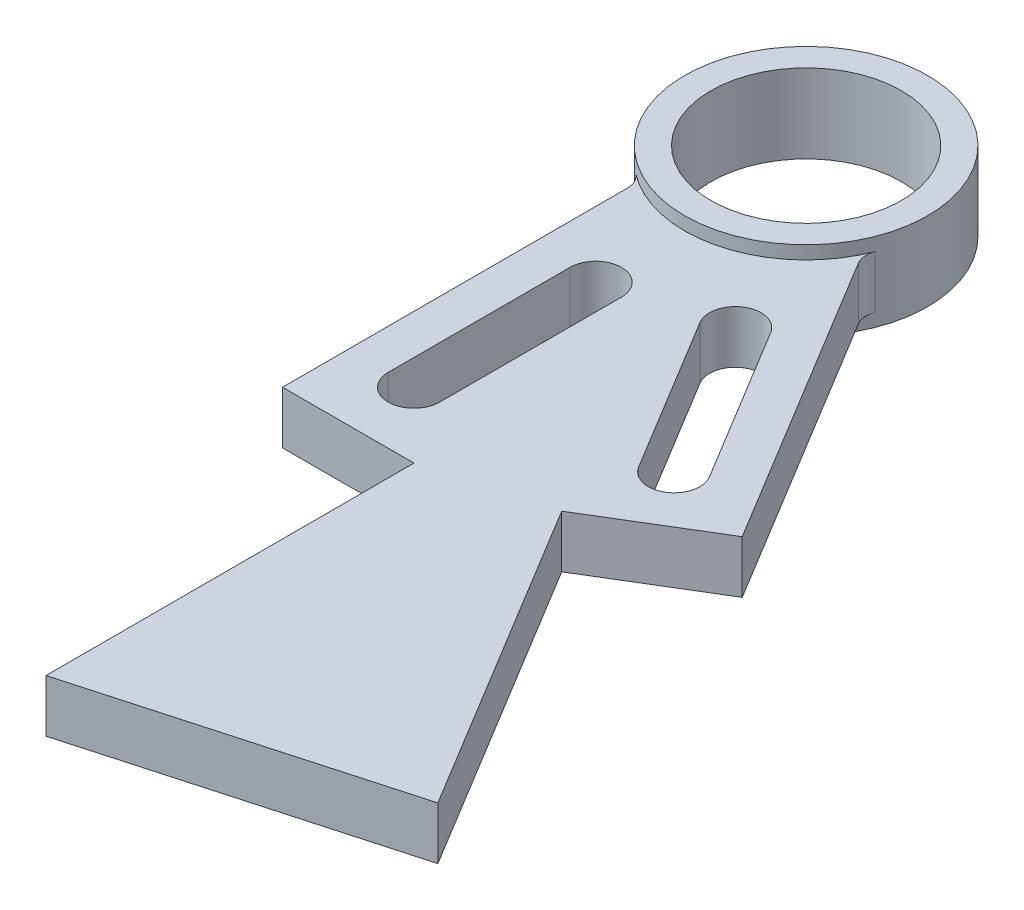
ISO-10303-21;
HEADER;
FILE_DESCRIPTION(('STEP AP214'),'2;1');
FILE_NAME('part.step','',(''),(''),'','','');
FILE_SCHEMA(('AUTOMOTIVE_DESIGN { 1 0 10303 214 1 1 1 1 }'));
ENDSEC;
DATA;
#1=APPLICATION_CONTEXT('core data for automotive mechanical design processes');
#2=APPLICATION_PROTOCOL_DEFINITION('international standard','automotive_design',2000,#1);
#3=PRODUCT_CONTEXT('',#1,'mechanical');
#4=PRODUCT('Part','Part','',(#3));
#5=PRODUCT_RELATED_PRODUCT_CATEGORY('part','',(#4));
#6=PRODUCT_DEFINITION_FORMATION('','',#4);
#7=PRODUCT_DEFINITION_CONTEXT('part definition',#1,'design');
#8=PRODUCT_DEFINITION('design','',#6,#7);
#9=PRODUCT_DEFINITION_SHAPE('','',#8);
#10=(LENGTH_UNIT() NAMED_UNIT(*) SI_UNIT(.MILLI.,.METRE.));
#11=(NAMED_UNIT(*) PLANE_ANGLE_UNIT() SI_UNIT($,.RADIAN.));
#12=(NAMED_UNIT(*) SI_UNIT($,.STERADIAN.) SOLID_ANGLE_UNIT());
#13=UNCERTAINTY_MEASURE_WITH_UNIT(LENGTH_MEASURE(1.E-05),#10,'distance_accuracy_value','');
#14=(GEOMETRIC_REPRESENTATION_CONTEXT(3) GLOBAL_UNCERTAINTY_ASSIGNED_CONTEXT((#13)) GLOBAL_UNIT_ASSIGNED_CONTEXT((#10,
#11,#12)) REPRESENTATION_CONTEXT('',''));
#15=CARTESIAN_POINT('',(0.,0.,0.));
#16=DIRECTION('',(0.,0.,1.));
#17=DIRECTION('',(1.,0.,0.));
#18=AXIS2_PLACEMENT_3D('',#15,#16,#17);
#19=CARTESIAN_POINT('',(0.,4.7625,0.));
#20=DIRECTION('',(0.,-1.,0.));
#21=DIRECTION('',(0.,0.,-1.));
#22=AXIS2_PLACEMENT_3D('',#19,#20,#21);
#23=CYLINDRICAL_SURFACE('',#22,11.5062);
#24=CARTESIAN_POINT('',(0.,4.7625,0.));
#25=DIRECTION('',(0.,1.,0.));
#26=DIRECTION('',(0.,0.,1.));
#27=AXIS2_PLACEMENT_3D('',#24,#25,#26);
#28=CIRCLE('',#27,11.5062);
#29=CARTESIAN_POINT('',(0.,4.7625,-11.5062));
#30=VERTEX_POINT('',#29);
#31=EDGE_CURVE('E303',#30,#30,#28,.T.);
#32=CARTESIAN_POINT('',(0.,-4.7625,0.));
#33=DIRECTION('',(0.,1.,0.));
#34=DIRECTION('',(0.,0.,1.));
#35=AXIS2_PLACEMENT_3D('',#32,#33,#34);
#36=CIRCLE('',#35,11.5062);
#37=CARTESIAN_POINT('',(0.,-4.7625,-11.5062));
#38=VERTEX_POINT('',#37);
#39=EDGE_CURVE('E285',#38,#38,#36,.T.);
#40=CARTESIAN_POINT('',(0.,4.7625,-11.5062));
#41=CARTESIAN_POINT('',(0.,4.66328125,-11.5062));
#42=CARTESIAN_POINT('',(0.,4.5640625,-11.5062));
#43=CARTESIAN_POINT('',(0.,4.365625,-11.5062));
#44=CARTESIAN_POINT('',(0.,4.26640625,-11.5062));
#45=CARTESIAN_POINT('',(0.,4.06796875,-11.5062));
#46=CARTESIAN_POINT('',(0.,3.96875,-11.5062));
#47=CARTESIAN_POINT('',(0.,3.7703125,-11.5062));
#48=CARTESIAN_POINT('',(0.,3.67109375,-11.5062));
#49=CARTESIAN_POINT('',(0.,3.47265625,-11.5062));
#50=CARTESIAN_POINT('',(0.,3.3734375,-11.5062));
#51=CARTESIAN_POINT('',(0.,3.175,-11.5062));
#52=CARTESIAN_POINT('',(0.,3.07578125,-11.5062));
#53=CARTESIAN_POINT('',(0.,2.87734375,-11.5062));
#54=CARTESIAN_POINT('',(0.,2.778125,-11.5062));
#55=CARTESIAN_POINT('',(0.,2.5796875,-11.5062));
#56=CARTESIAN_POINT('',(0.,2.48046875,-11.5062));
#57=CARTESIAN_POINT('',(0.,2.28203125,-11.5062));
#58=CARTESIAN_POINT('',(0.,2.1828125,-11.5062));
#59=CARTESIAN_POINT('',(0.,1.984375,-11.5062));
#60=CARTESIAN_POINT('',(0.,1.88515625,-11.5062));
#61=CARTESIAN_POINT('',(0.,1.68671875,-11.5062));
#62=CARTESIAN_POINT('',(0.,1.5875,-11.5062));
#63=CARTESIAN_POINT('',(0.,1.3890625,-11.5062));
#64=CARTESIAN_POINT('',(0.,1.28984375,-11.5062));
#65=CARTESIAN_POINT('',(0.,1.09140625,-11.5062));
#66=CARTESIAN_POINT('',(0.,0.992187499999999,-11.5062));
#67=CARTESIAN_POINT('',(0.,0.79375,-11.5062));
#68=CARTESIAN_POINT('',(0.,0.69453125,-11.5062));
#69=CARTESIAN_POINT('',(0.,0.49609375,-11.5062));
#70=CARTESIAN_POINT('',(0.,0.396875,-11.5062));
#71=CARTESIAN_POINT('',(0.,0.1984375,-11.5062));
#72=CARTESIAN_POINT('',(0.,0.0992187500000001,-11.5062));
#73=CARTESIAN_POINT('',(0.,-0.0992187500000001,-11.5062));
#74=CARTESIAN_POINT('',(0.,-0.1984375,-11.5062));
#75=CARTESIAN_POINT('',(0.,-0.396875,-11.5062));
#76=CARTESIAN_POINT('',(0.,-0.49609375,-11.5062));
#77=CARTESIAN_POINT('',(0.,-0.69453125,-11.5062));
#78=CARTESIAN_POINT('',(0.,-0.793750000000001,-11.5062));
#79=CARTESIAN_POINT('',(0.,-0.992187500000001,-11.5062));
#80=CARTESIAN_POINT('',(0.,-1.09140625,-11.5062));
#81=CARTESIAN_POINT('',(0.,-1.28984375,-11.5062));
#82=CARTESIAN_POINT('',(0.,-1.3890625,-11.5062));
#83=CARTESIAN_POINT('',(0.,-1.5875,-11.5062));
#84=CARTESIAN_POINT('',(0.,-1.68671875,-11.5062));
#85=CARTESIAN_POINT('',(0.,-1.88515625,-11.5062));
#86=CARTESIAN_POINT('',(0.,-1.984375,-11.5062));
#87=CARTESIAN_POINT('',(0.,-2.1828125,-11.5062));
#88=CARTESIAN_POINT('',(0.,-2.28203125,-11.5062));
#89=CARTESIAN_POINT('',(0.,-2.48046875,-11.5062));
#90=CARTESIAN_POINT('',(0.,-2.5796875,-11.5062));
#91=CARTESIAN_POINT('',(0.,-2.778125,-11.5062));
#92=CARTESIAN_POINT('',(0.,-2.87734375,-11.5062));
#93=CARTESIAN_POINT('',(0.,-3.07578125,-11.5062));
#94=CARTESIAN_POINT('',(0.,-3.175,-11.5062));
#95=CARTESIAN_POINT('',(0.,-3.3734375,-11.5062));
#96=CARTESIAN_POINT('',(0.,-3.47265625,-11.5062));
#97=CARTESIAN_POINT('',(0.,-3.67109375,-11.5062));
#98=CARTESIAN_POINT('',(0.,-3.7703125,-11.5062));
#99=CARTESIAN_POINT('',(0.,-3.96875,-11.5062));
#100=CARTESIAN_POINT('',(0.,-4.06796875,-11.5062));
#101=CARTESIAN_POINT('',(0.,-4.26640625,-11.5062));
#102=CARTESIAN_POINT('',(0.,-4.365625,-11.5062));
#103=CARTESIAN_POINT('',(0.,-4.5640625,-11.5062));
#104=CARTESIAN_POINT('',(0.,-4.66328125,-11.5062));
#105=CARTESIAN_POINT('',(0.,-4.7625,-11.5062));
#106=B_SPLINE_CURVE_WITH_KNOTS('',3,(#40,#41,#42,#43,#44,#45,#46,#47,#48,#49,#50,#51,#52,#53,
#54,#55,#56,#57,#58,#59,#60,#61,#62,#63,#64,#65,#66,#67,#68,#69,#70,#71,#72,#73,#74,#75,#76,#77,
#78,#79,#80,#81,#82,#83,#84,#85,#86,#87,#88,#89,#90,#91,#92,#93,#94,#95,#96,#97,#98,#99,#100,
#101,#102,#103,#104,#105),.UNSPECIFIED.,.F.,.F.,(4,2,2,2,2,2,2,2,2,2,2,2,2,2,2,2,2,2,2,2,2,2,2,
2,2,2,2,2,2,2,2,2,4),(0.,0.29765625,0.5953125,0.892968750000001,1.190625,1.48828125,1.7859375,
2.08359375,2.38125,2.67890625,2.9765625,3.27421875,3.571875,3.86953125,4.1671875,4.46484375,
4.7625,5.06015625,5.3578125,5.65546875,5.953125,6.25078125,6.5484375,6.84609375,7.14375,
7.44140625,7.7390625,8.03671875,8.334375,8.63203125,8.9296875,9.22734375,9.525),.UNSPECIFIED.);
#107=EDGE_CURVE('BSEAM45',#30,#38,#106,.T.);
#108=ORIENTED_EDGE('',*,*,#31,.T.);
#109=ORIENTED_EDGE('',*,*,#39,.F.);
#110=ORIENTED_EDGE('',*,*,#107,.T.);
#111=ORIENTED_EDGE('',*,*,#107,.F.);
#112=EDGE_LOOP('',(#108,#110,#109,#111));
#113=FACE_BOUND('',#112,.T.);
#114=ADVANCED_FACE('F45',(#113),#23,.F.);
#115=CARTESIAN_POINT('',(0.,4.7625,0.));
#116=DIRECTION('',(0.,-1.,0.));
#117=DIRECTION('',(0.,0.,-1.));
#118=AXIS2_PLACEMENT_3D('',#115,#116,#117);
#119=CYLINDRICAL_SURFACE('',#118,14.6812);
#120=DIRECTION('',(0.,-1.,0.));
#121=VECTOR('',#120,1.);
#122=CARTESIAN_POINT('',(13.6784635519354,4.7625,5.33266052720171));
#123=LINE('',#122,#121);
#124=CARTESIAN_POINT('',(13.6784635519354,3.175,5.33266052720171));
#125=VERTEX_POINT('',#124);
#126=CARTESIAN_POINT('',(13.6784635519354,-3.175,5.33266052720171));
#127=VERTEX_POINT('',#126);
#128=EDGE_CURVE('E317',#125,#127,#123,.T.);
#129=ORIENTED_EDGE('',*,*,#128,.T.);
#130=CARTESIAN_POINT('',(0.,-3.175,0.));
#131=DIRECTION('',(0.,1.,0.));
#132=DIRECTION('',(0.,0.,1.));
#133=AXIS2_PLACEMENT_3D('',#130,#131,#132);
#134=CIRCLE('',#133,14.6812);
#135=CARTESIAN_POINT('',(-8.9321460176991,-3.175,11.6513690594068));
#136=VERTEX_POINT('',#135);
#137=EDGE_CURVE('E251',#136,#127,#134,.T.);
#138=ORIENTED_EDGE('',*,*,#137,.F.);
#139=DIRECTION('',(0.,-1.,0.));
#140=VECTOR('',#139,1.);
#141=CARTESIAN_POINT('',(-8.9321460176991,4.7625,11.6513690594068));
#142=LINE('',#141,#140);
#143=CARTESIAN_POINT('',(-8.9321460176991,3.175,11.6513690594068));
#144=VERTEX_POINT('',#143);
#145=EDGE_CURVE('E310',#136,#144,#142,.F.);
#146=ORIENTED_EDGE('',*,*,#145,.T.);
#147=CARTESIAN_POINT('',(0.,3.175,0.));
#148=DIRECTION('',(0.,1.,0.));
#149=DIRECTION('',(0.,0.,1.));
#150=AXIS2_PLACEMENT_3D('',#147,#148,#149);
#151=CIRCLE('',#150,14.6812);
#152=EDGE_CURVE('E209',#144,#125,#151,.T.);
#153=ORIENTED_EDGE('',*,*,#152,.T.);
#154=EDGE_LOOP('',(#129,#138,#146,#153));
#155=FACE_BOUND('',#154,.T.);
#156=CARTESIAN_POINT('',(0.,4.7625,0.));
#157=DIRECTION('',(0.,1.,0.));
#158=DIRECTION('',(0.,0.,1.));
#159=AXIS2_PLACEMENT_3D('',#156,#157,#158);
#160=CIRCLE('',#159,14.6812);
#161=CARTESIAN_POINT('',(0.,4.7625,14.6812));
#162=VERTEX_POINT('',#161);
#163=EDGE_CURVE('E306',#162,#162,#160,.T.);
#164=ORIENTED_EDGE('',*,*,#163,.F.);
#165=EDGE_LOOP('',(#164));
#166=FACE_BOUND('',#165,.T.);
#167=CARTESIAN_POINT('',(0.,-4.7625,0.));
#168=DIRECTION('',(0.,1.,0.));
#169=DIRECTION('',(0.,0.,1.));
#170=AXIS2_PLACEMENT_3D('',#167,#168,#169);
#171=CIRCLE('',#170,14.6812);
#172=CARTESIAN_POINT('',(0.,-4.7625,14.6812));
#173=VERTEX_POINT('',#172);
#174=EDGE_CURVE('E307',#173,#173,#171,.T.);
#175=ORIENTED_EDGE('',*,*,#174,.T.);
#176=EDGE_LOOP('',(#175));
#177=FACE_BOUND('',#176,.T.);
#178=ADVANCED_FACE('F335',(#155,#166,#177),#119,.T.);
#179=CARTESIAN_POINT('',(0.,4.7625,0.));
#180=DIRECTION('',(0.,1.,0.));
#181=DIRECTION('',(0.,0.,1.));
#182=AXIS2_PLACEMENT_3D('',#179,#180,#181);
#183=PLANE('',#182);
#184=ORIENTED_EDGE('',*,*,#31,.F.);
#185=EDGE_LOOP('',(#184));
#186=FACE_BOUND('',#185,.T.);
#187=ORIENTED_EDGE('',*,*,#163,.T.);
#188=EDGE_LOOP('',(#187));
#189=FACE_BOUND('',#188,.T.);
#190=ADVANCED_FACE('F399',(#186,#189),#183,.T.);
#191=CARTESIAN_POINT('',(0.,-4.7625,0.));
#192=DIRECTION('',(0.,1.,0.));
#193=DIRECTION('',(0.,0.,1.));
#194=AXIS2_PLACEMENT_3D('',#191,#192,#193);
#195=PLANE('',#194);
#196=ORIENTED_EDGE('',*,*,#39,.T.);
#197=EDGE_LOOP('',(#196));
#198=FACE_BOUND('',#197,.T.);
#199=ORIENTED_EDGE('',*,*,#174,.F.);
#200=EDGE_LOOP('',(#199));
#201=FACE_BOUND('',#200,.T.);
#202=ADVANCED_FACE('F403',(#198,#201),#195,.F.);
#203=CARTESIAN_POINT('',(0.,3.175,25.4127));
#204=DIRECTION('',(0.,-1.,0.));
#205=DIRECTION('',(0.,0.,-1.));
#206=AXIS2_PLACEMENT_3D('',#203,#204,#205);
#207=CYLINDRICAL_SURFACE('',#206,3.1115);
#208=CARTESIAN_POINT('',(0.,-3.175,25.4127));
#209=DIRECTION('',(0.,1.,0.));
#210=DIRECTION('',(0.,0.,1.));
#211=AXIS2_PLACEMENT_3D('',#208,#209,#210);
#212=CIRCLE('',#211,3.1115);
#213=CARTESIAN_POINT('',(3.1115,-3.175,25.4127));
#214=VERTEX_POINT('',#213);
#215=CARTESIAN_POINT('',(-3.11150000000001,-3.175,25.4127));
#216=VERTEX_POINT('',#215);
#217=EDGE_CURVE('E265',#214,#216,#212,.T.);
#218=ORIENTED_EDGE('',*,*,#217,.F.);
#219=DIRECTION('',(0.,-1.,0.));
#220=VECTOR('',#219,1.);
#221=CARTESIAN_POINT('',(3.1115,3.175,25.4127));
#222=LINE('',#221,#220);
#223=CARTESIAN_POINT('',(3.1115,3.175,25.4127));
#224=VERTEX_POINT('',#223);
#225=EDGE_CURVE('E283',#224,#214,#222,.T.);
#226=ORIENTED_EDGE('',*,*,#225,.F.);
#227=CARTESIAN_POINT('',(0.,3.175,25.4127));
#228=DIRECTION('',(0.,1.,0.));
#229=DIRECTION('',(0.,0.,1.));
#230=AXIS2_PLACEMENT_3D('',#227,#228,#229);
#231=CIRCLE('',#230,3.1115);
#232=CARTESIAN_POINT('',(-3.11150000000001,3.175,25.4127));
#233=VERTEX_POINT('',#232);
#234=EDGE_CURVE('E221',#224,#233,#231,.T.);
#235=ORIENTED_EDGE('',*,*,#234,.T.);
#236=DIRECTION('',(0.,-1.,0.));
#237=VECTOR('',#236,1.);
#238=CARTESIAN_POINT('',(-3.11150000000001,3.175,25.4127));
#239=LINE('',#238,#237);
#240=EDGE_CURVE('E276',#233,#216,#239,.T.);
#241=ORIENTED_EDGE('',*,*,#240,.T.);
#242=EDGE_LOOP('',(#218,#226,#235,#241));
#243=FACE_BOUND('',#242,.T.);
#244=ADVANCED_FACE('F384',(#243),#207,.F.);
#245=CARTESIAN_POINT('',(3.11149999999999,3.175,0.));
#246=DIRECTION('',(-1.,0.,0.));
#247=DIRECTION('',(0.,0.,1.));
#248=AXIS2_PLACEMENT_3D('',#245,#246,#247);
#249=PLANE('',#248);
#250=DIRECTION('',(0.,0.,-1.));
#251=VECTOR('',#250,1.);
#252=CARTESIAN_POINT('',(3.11149999999999,-3.175,0.));
#253=LINE('',#252,#251);
#254=CARTESIAN_POINT('',(3.1115,-3.175,47.3837));
#255=VERTEX_POINT('',#254);
#256=EDGE_CURVE('E268',#255,#214,#253,.T.);
#257=ORIENTED_EDGE('',*,*,#256,.F.);
#258=DIRECTION('',(0.,-1.,0.));
#259=VECTOR('',#258,1.);
#260=CARTESIAN_POINT('',(3.1115,3.175,47.3837));
#261=LINE('',#260,#259);
#262=CARTESIAN_POINT('',(3.1115,3.175,47.3837));
#263=VERTEX_POINT('',#262);
#264=EDGE_CURVE('E281',#263,#255,#261,.T.);
#265=ORIENTED_EDGE('',*,*,#264,.F.);
#266=DIRECTION('',(0.,0.,-1.));
#267=VECTOR('',#266,1.);
#268=CARTESIAN_POINT('',(3.11149999999999,3.175,0.));
#269=LINE('',#268,#267);
#270=EDGE_CURVE('E224',#263,#224,#269,.T.);
#271=ORIENTED_EDGE('',*,*,#270,.T.);
#272=ORIENTED_EDGE('',*,*,#225,.T.);
#273=EDGE_LOOP('',(#257,#265,#271,#272));
#274=FACE_BOUND('',#273,.T.);
#275=ADVANCED_FACE('F377',(#274),#249,.T.);
#276=CARTESIAN_POINT('',(0.,3.175,47.3837));
#277=DIRECTION('',(0.,-1.,0.));
#278=DIRECTION('',(0.,0.,-1.));
#279=AXIS2_PLACEMENT_3D('',#276,#277,#278);
#280=CYLINDRICAL_SURFACE('',#279,3.1115);
#281=CARTESIAN_POINT('',(0.,-3.175,47.3837));
#282=DIRECTION('',(0.,1.,0.));
#283=DIRECTION('',(0.,0.,1.));
#284=AXIS2_PLACEMENT_3D('',#281,#282,#283);
#285=CIRCLE('',#284,3.1115);
#286=CARTESIAN_POINT('',(-3.1115,-3.175,47.3837));
#287=VERTEX_POINT('',#286);
#288=EDGE_CURVE('E271',#287,#255,#285,.T.);
#289=ORIENTED_EDGE('',*,*,#288,.F.);
#290=DIRECTION('',(0.,-1.,0.));
#291=VECTOR('',#290,1.);
#292=CARTESIAN_POINT('',(-3.1115,3.175,47.3837));
#293=LINE('',#292,#291);
#294=CARTESIAN_POINT('',(-3.1115,3.175,47.3837));
#295=VERTEX_POINT('',#294);
#296=EDGE_CURVE('E278',#295,#287,#293,.T.);
#297=ORIENTED_EDGE('',*,*,#296,.F.);
#298=CARTESIAN_POINT('',(0.,3.175,47.3837));
#299=DIRECTION('',(0.,1.,0.));
#300=DIRECTION('',(0.,0.,1.));
#301=AXIS2_PLACEMENT_3D('',#298,#299,#300);
#302=CIRCLE('',#301,3.1115);
#303=EDGE_CURVE('E227',#295,#263,#302,.T.);
#304=ORIENTED_EDGE('',*,*,#303,.T.);
#305=ORIENTED_EDGE('',*,*,#264,.T.);
#306=EDGE_LOOP('',(#289,#297,#304,#305));
#307=FACE_BOUND('',#306,.T.);
#308=ADVANCED_FACE('F381',(#307),#280,.F.);
#309=CARTESIAN_POINT('',(-6.78752562472246,3.175,4.11502152409131));
#310=DIRECTION('',(0.85512133854772,0.,-0.518427908546941));
#311=DIRECTION('',(-0.518427908546941,0.,-0.85512133854772));
#312=AXIS2_PLACEMENT_3D('',#309,#310,#311);
#313=PLANE('',#312);
#314=DIRECTION('',(0.518427908546941,0.,0.85512133854772));
#315=VECTOR('',#314,1.);
#316=CARTESIAN_POINT('',(-6.78752562472246,-3.175,4.11502152409131));
#317=LINE('',#316,#315);
#318=CARTESIAN_POINT('',(21.8925283895844,-3.175,51.4213601181571));
#319=VERTEX_POINT('',#318);
#320=CARTESIAN_POINT('',(44.9366489244959,-3.175,89.4315036166033));
#321=VERTEX_POINT('',#320);
#322=EDGE_CURVE('E242',#319,#321,#317,.T.);
#323=ORIENTED_EDGE('',*,*,#322,.F.);
#324=DIRECTION('',(0.,-1.,0.));
#325=VECTOR('',#324,1.);
#326=CARTESIAN_POINT('',(21.8925283895844,3.175,51.4213601181571));
#327=LINE('',#326,#325);
#328=CARTESIAN_POINT('',(21.8925283895844,3.175,51.4213601181571));
#329=VERTEX_POINT('',#328);
#330=EDGE_CURVE('E279',#329,#319,#327,.T.);
#331=ORIENTED_EDGE('',*,*,#330,.F.);
#332=DIRECTION('',(0.518427908546941,0.,0.85512133854772));
#333=VECTOR('',#332,1.);
#334=CARTESIAN_POINT('',(-6.78752562472246,3.175,4.11502152409131));
#335=LINE('',#334,#333);
#336=CARTESIAN_POINT('',(44.9366489244959,3.175,89.4315036166033));
#337=VERTEX_POINT('',#336);
#338=EDGE_CURVE('E200',#329,#337,#335,.T.);
#339=ORIENTED_EDGE('',*,*,#338,.T.);
#340=DIRECTION('',(0.,-1.,0.));
#341=VECTOR('',#340,1.);
#342=CARTESIAN_POINT('',(44.9366489244959,3.175,89.4315036166033));
#343=LINE('',#342,#341);
#344=EDGE_CURVE('E180',#337,#321,#343,.T.);
#345=ORIENTED_EDGE('',*,*,#344,.T.);
#346=EDGE_LOOP('',(#323,#331,#339,#345));
#347=FACE_BOUND('',#346,.T.);
#348=ADVANCED_FACE('F351',(#347),#313,.T.);
#349=CARTESIAN_POINT('',(28.6800540143069,3.175,47.3063385940658));
#350=DIRECTION('',(-0.518427908546941,0.,-0.85512133854772));
#351=DIRECTION('',(-0.85512133854772,0.,0.518427908546941));
#352=AXIS2_PLACEMENT_3D('',#349,#350,#351);
#353=PLANE('',#352);
#354=DIRECTION('',(0.85512133854772,0.,-0.518427908546941));
#355=VECTOR('',#354,1.);
#356=CARTESIAN_POINT('',(28.6800540143069,-3.175,47.3063385940658));
#357=LINE('',#356,#355);
#358=CARTESIAN_POINT('',(35.4675796390295,-3.175,43.1913170699744));
#359=VERTEX_POINT('',#358);
#360=EDGE_CURVE('E245',#319,#359,#357,.T.);
#361=ORIENTED_EDGE('',*,*,#360,.T.);
#362=DIRECTION('',(0.,-1.,0.));
#363=VECTOR('',#362,1.);
#364=CARTESIAN_POINT('',(35.4675796390295,3.175,43.1913170699744));
#365=LINE('',#364,#363);
#366=CARTESIAN_POINT('',(35.4675796390295,3.175,43.1913170699744));
#367=VERTEX_POINT('',#366);
#368=EDGE_CURVE('E295',#367,#359,#365,.T.);
#369=ORIENTED_EDGE('',*,*,#368,.F.);
#370=DIRECTION('',(0.85512133854772,0.,-0.518427908546941));
#371=VECTOR('',#370,1.);
#372=CARTESIAN_POINT('',(28.6800540143069,3.175,47.3063385940658));
#373=LINE('',#372,#371);
#374=EDGE_CURVE('E203',#329,#367,#373,.T.);
#375=ORIENTED_EDGE('',*,*,#374,.F.);
#376=ORIENTED_EDGE('',*,*,#330,.T.);
#377=EDGE_LOOP('',(#361,#369,#375,#376));
#378=FACE_BOUND('',#377,.T.);
#379=ADVANCED_FACE('F348',(#378),#353,.F.);
#380=CARTESIAN_POINT('',(6.78752562472259,3.175,-4.11502152409138));
#381=DIRECTION('',(-0.85512133854772,0.,0.518427908546941));
#382=DIRECTION('',(0.518427908546941,0.,0.85512133854772));
#383=AXIS2_PLACEMENT_3D('',#380,#381,#382);
#384=PLANE('',#383);
#385=DIRECTION('',(-0.518427908546941,0.,-0.85512133854772));
#386=VECTOR('',#385,1.);
#387=CARTESIAN_POINT('',(6.78752562472259,-3.175,-4.11502152409138));
#388=LINE('',#387,#386);
#389=CARTESIAN_POINT('',(13.8729715374801,-3.175,7.57207304245448));
#390=VERTEX_POINT('',#389);
#391=EDGE_CURVE('E248',#359,#390,#388,.T.);
#392=ORIENTED_EDGE('',*,*,#391,.T.);
#393=DIRECTION('',(0.,1.,0.));
#394=VECTOR('',#393,1.);
#395=CARTESIAN_POINT('',(13.8729715374801,3.175,7.57207304245448));
#396=LINE('',#395,#394);
#397=CARTESIAN_POINT('',(13.8729715374801,3.175,7.57207304245448));
#398=VERTEX_POINT('',#397);
#399=EDGE_CURVE('E320',#390,#398,#396,.T.);
#400=ORIENTED_EDGE('',*,*,#399,.T.);
#401=DIRECTION('',(-0.518427908546941,0.,-0.85512133854772));
#402=VECTOR('',#401,1.);
#403=CARTESIAN_POINT('',(6.78752562472259,3.175,-4.11502152409138));
#404=LINE('',#403,#402);
#405=EDGE_CURVE('E206',#367,#398,#404,.T.);
#406=ORIENTED_EDGE('',*,*,#405,.F.);
#407=ORIENTED_EDGE('',*,*,#368,.T.);
#408=EDGE_LOOP('',(#392,#400,#406,#407));
#409=FACE_BOUND('',#408,.T.);
#410=ADVANCED_FACE('F344',(#409),#384,.F.);
#411=CARTESIAN_POINT('',(-7.93749999999998,3.175,0.));
#412=DIRECTION('',(-1.,0.,0.));
#413=DIRECTION('',(0.,0.,1.));
#414=AXIS2_PLACEMENT_3D('',#411,#412,#413);
#415=PLANE('',#414);
#416=DIRECTION('',(0.,0.,-1.));
#417=VECTOR('',#416,1.);
#418=CARTESIAN_POINT('',(-7.93749999999998,3.175,0.));
#419=LINE('',#418,#417);
#420=CARTESIAN_POINT('',(-7.93749999999998,3.175,55.3212));
#421=VERTEX_POINT('',#420);
#422=CARTESIAN_POINT('',(-7.93749999999998,3.175,13.6671768551519));
#423=VERTEX_POINT('',#422);
#424=EDGE_CURVE('E211',#421,#423,#419,.T.);
#425=ORIENTED_EDGE('',*,*,#424,.T.);
#426=DIRECTION('',(0.,-1.,0.));
#427=VECTOR('',#426,1.);
#428=CARTESIAN_POINT('',(-7.93749999999998,3.175,13.6671768551519));
#429=LINE('',#428,#427);
#430=CARTESIAN_POINT('',(-7.93749999999998,-3.175,13.6671768551519));
#431=VERTEX_POINT('',#430);
#432=EDGE_CURVE('E322',#423,#431,#429,.T.);
#433=ORIENTED_EDGE('',*,*,#432,.T.);
#434=DIRECTION('',(0.,0.,-1.));
#435=VECTOR('',#434,1.);
#436=CARTESIAN_POINT('',(-7.93749999999998,-3.175,0.));
#437=LINE('',#436,#435);
#438=CARTESIAN_POINT('',(-7.93749999999998,-3.175,55.3212));
#439=VERTEX_POINT('',#438);
#440=EDGE_CURVE('E253',#439,#431,#437,.T.);
#441=ORIENTED_EDGE('',*,*,#440,.F.);
#442=DIRECTION('',(0.,-1.,0.));
#443=VECTOR('',#442,1.);
#444=CARTESIAN_POINT('',(-7.93749999999998,3.175,55.3212));
#445=LINE('',#444,#443);
#446=EDGE_CURVE('E293',#421,#439,#445,.T.);
#447=ORIENTED_EDGE('',*,*,#446,.F.);
#448=EDGE_LOOP('',(#425,#433,#441,#447));
#449=FACE_BOUND('',#448,.T.);
#450=ADVANCED_FACE('F364',(#449),#415,.T.);
#451=CARTESIAN_POINT('',(0.,3.175,55.3212));
#452=DIRECTION('',(0.,0.,-1.));
#453=DIRECTION('',(-1.,0.,0.));
#454=AXIS2_PLACEMENT_3D('',#451,#452,#453);
#455=PLANE('',#454);
#456=DIRECTION('',(1.,0.,0.));
#457=VECTOR('',#456,1.);
#458=CARTESIAN_POINT('',(0.,-3.175,55.3212));
#459=LINE('',#458,#457);
#460=CARTESIAN_POINT('',(7.93750000000002,-3.175,55.3212));
#461=VERTEX_POINT('',#460);
#462=EDGE_CURVE('E256',#439,#461,#459,.T.);
#463=ORIENTED_EDGE('',*,*,#462,.T.);
#464=DIRECTION('',(0.,-1.,0.));
#465=VECTOR('',#464,1.);
#466=CARTESIAN_POINT('',(7.93750000000002,3.175,55.3212));
#467=LINE('',#466,#465);
#468=CARTESIAN_POINT('',(7.93750000000002,3.175,55.3212));
#469=VERTEX_POINT('',#468);
#470=EDGE_CURVE('E290',#469,#461,#467,.T.);
#471=ORIENTED_EDGE('',*,*,#470,.F.);
#472=DIRECTION('',(1.,0.,0.));
#473=VECTOR('',#472,1.);
#474=CARTESIAN_POINT('',(0.,3.175,55.3212));
#475=LINE('',#474,#473);
#476=EDGE_CURVE('E213',#421,#469,#475,.T.);
#477=ORIENTED_EDGE('',*,*,#476,.F.);
#478=ORIENTED_EDGE('',*,*,#446,.T.);
#479=EDGE_LOOP('',(#463,#471,#477,#478));
#480=FACE_BOUND('',#479,.T.);
#481=ADVANCED_FACE('F362',(#480),#455,.F.);
#482=CARTESIAN_POINT('',(7.93750000000005,3.175,0.));
#483=DIRECTION('',(1.,0.,0.));
#484=DIRECTION('',(0.,0.,-1.));
#485=AXIS2_PLACEMENT_3D('',#482,#483,#484);
#486=PLANE('',#485);
#487=DIRECTION('',(0.,0.,1.));
#488=VECTOR('',#487,1.);
#489=CARTESIAN_POINT('',(7.93750000000005,-3.175,0.));
#490=LINE('',#489,#488);
#491=CARTESIAN_POINT('',(7.9375,-3.175,99.7712));
#492=VERTEX_POINT('',#491);
#493=EDGE_CURVE('E259',#461,#492,#490,.T.);
#494=ORIENTED_EDGE('',*,*,#493,.T.);
#495=DIRECTION('',(0.,-1.,0.));
#496=VECTOR('',#495,1.);
#497=CARTESIAN_POINT('',(7.9375,3.175,99.7712));
#498=LINE('',#497,#496);
#499=CARTESIAN_POINT('',(7.9375,3.175,99.7712));
#500=VERTEX_POINT('',#499);
#501=EDGE_CURVE('E287',#500,#492,#498,.T.);
#502=ORIENTED_EDGE('',*,*,#501,.F.);
#503=DIRECTION('',(0.,0.,1.));
#504=VECTOR('',#503,1.);
#505=CARTESIAN_POINT('',(7.93750000000005,3.175,0.));
#506=LINE('',#505,#504);
#507=EDGE_CURVE('E216',#469,#500,#506,.T.);
#508=ORIENTED_EDGE('',*,*,#507,.F.);
#509=ORIENTED_EDGE('',*,*,#470,.T.);
#510=EDGE_LOOP('',(#494,#502,#508,#509));
#511=FACE_BOUND('',#510,.T.);
#512=ADVANCED_FACE('F359',(#511),#486,.F.);
#513=CARTESIAN_POINT('',(24.5650324902156,3.175,40.5188129693433));
#514=DIRECTION('',(0.,-1.,0.));
#515=DIRECTION('',(0.,0.,-1.));
#516=AXIS2_PLACEMENT_3D('',#513,#514,#515);
#517=CYLINDRICAL_SURFACE('',#516,3.1115);
#518=CARTESIAN_POINT('',(24.5650324902156,-3.175,40.5188129693433));
#519=DIRECTION('',(0.,1.,0.));
#520=DIRECTION('',(0.,0.,1.));
#521=AXIS2_PLACEMENT_3D('',#518,#519,#520);
#522=CIRCLE('',#521,3.1115);
#523=CARTESIAN_POINT('',(21.9043224453243,-3.175,42.1319014067871));
#524=VERTEX_POINT('',#523);
#525=CARTESIAN_POINT('',(27.2257425351068,-3.175,38.9057245318995));
#526=VERTEX_POINT('',#525);
#527=EDGE_CURVE('E175',#524,#526,#522,.T.);
#528=ORIENTED_EDGE('',*,*,#527,.F.);
#529=DIRECTION('',(0.,-1.,0.));
#530=VECTOR('',#529,1.);
#531=CARTESIAN_POINT('',(21.9043224453243,3.175,42.1319014067871));
#532=LINE('',#531,#530);
#533=CARTESIAN_POINT('',(21.9043224453243,3.175,42.1319014067871));
#534=VERTEX_POINT('',#533);
#535=EDGE_CURVE('E170',#534,#524,#532,.T.);
#536=ORIENTED_EDGE('',*,*,#535,.F.);
#537=CARTESIAN_POINT('',(24.5650324902156,3.175,40.5188129693433));
#538=DIRECTION('',(0.,1.,0.));
#539=DIRECTION('',(0.,0.,1.));
#540=AXIS2_PLACEMENT_3D('',#537,#538,#539);
#541=CIRCLE('',#540,3.1115);
#542=CARTESIAN_POINT('',(27.2257425351068,3.175,38.9057245318995));
#543=VERTEX_POINT('',#542);
#544=EDGE_CURVE('E173',#534,#543,#541,.T.);
#545=ORIENTED_EDGE('',*,*,#544,.T.);
#546=DIRECTION('',(0.,-1.,0.));
#547=VECTOR('',#546,1.);
#548=CARTESIAN_POINT('',(27.2257425351068,3.175,38.9057245318995));
#549=LINE('',#548,#547);
#550=EDGE_CURVE('E232',#543,#526,#549,.T.);
#551=ORIENTED_EDGE('',*,*,#550,.T.);
#552=EDGE_LOOP('',(#528,#536,#545,#551));
#553=FACE_BOUND('',#552,.T.);
#554=ADVANCED_FACE('F172',(#553),#517,.F.);
#555=CARTESIAN_POINT('',(-2.6607100448912,3.175,1.61308843744379));
#556=DIRECTION('',(0.85512133854772,0.,-0.518427908546942));
#557=DIRECTION('',(-0.518427908546942,0.,-0.85512133854772));
#558=AXIS2_PLACEMENT_3D('',#555,#556,#557);
#559=PLANE('',#558);
#560=DIRECTION('',(0.518427908546942,0.,0.85512133854772));
#561=VECTOR('',#560,1.);
#562=CARTESIAN_POINT('',(-2.6607100448912,-3.175,1.61308843744379));
#563=LINE('',#562,#561);
#564=CARTESIAN_POINT('',(10.5139428666395,-3.175,23.3440304775552));
#565=VERTEX_POINT('',#564);
#566=EDGE_CURVE('E234',#565,#524,#563,.T.);
#567=ORIENTED_EDGE('',*,*,#566,.F.);
#568=DIRECTION('',(0.,-1.,0.));
#569=VECTOR('',#568,1.);
#570=CARTESIAN_POINT('',(10.5139428666395,3.175,23.3440304775552));
#571=LINE('',#570,#569);
#572=CARTESIAN_POINT('',(10.5139428666395,3.175,23.3440304775552));
#573=VERTEX_POINT('',#572);
#574=EDGE_CURVE('E181',#573,#565,#571,.T.);
#575=ORIENTED_EDGE('',*,*,#574,.F.);
#576=DIRECTION('',(0.518427908546942,0.,0.85512133854772));
#577=VECTOR('',#576,1.);
#578=CARTESIAN_POINT('',(-2.6607100448912,3.175,1.61308843744379));
#579=LINE('',#578,#577);
#580=EDGE_CURVE('E187',#573,#534,#579,.T.);
#581=ORIENTED_EDGE('',*,*,#580,.T.);
#582=ORIENTED_EDGE('',*,*,#535,.T.);
#583=EDGE_LOOP('',(#567,#575,#581,#582));
#584=FACE_BOUND('',#583,.T.);
#585=ADVANCED_FACE('F194',(#584),#559,.T.);
#586=CARTESIAN_POINT('',(13.1746529115307,3.175,21.7309420401113));
#587=DIRECTION('',(0.,-1.,0.));
#588=DIRECTION('',(0.,0.,-1.));
#589=AXIS2_PLACEMENT_3D('',#586,#587,#588);
#590=CYLINDRICAL_SURFACE('',#589,3.11150000000001);
#591=CARTESIAN_POINT('',(13.1746529115307,-3.175,21.7309420401113));
#592=DIRECTION('',(0.,1.,0.));
#593=DIRECTION('',(0.,0.,1.));
#594=AXIS2_PLACEMENT_3D('',#591,#592,#593);
#595=CIRCLE('',#594,3.11150000000001);
#596=CARTESIAN_POINT('',(15.835362956422,-3.175,20.1178536026675));
#597=VERTEX_POINT('',#596);
#598=EDGE_CURVE('E236',#597,#565,#595,.T.);
#599=ORIENTED_EDGE('',*,*,#598,.F.);
#600=DIRECTION('',(0.,-1.,0.));
#601=VECTOR('',#600,1.);
#602=CARTESIAN_POINT('',(15.835362956422,3.175,20.1178536026675));
#603=LINE('',#602,#601);
#604=CARTESIAN_POINT('',(15.835362956422,3.175,20.1178536026675));
#605=VERTEX_POINT('',#604);
#606=EDGE_CURVE('E300',#605,#597,#603,.T.);
#607=ORIENTED_EDGE('',*,*,#606,.F.);
#608=CARTESIAN_POINT('',(13.1746529115307,3.175,21.7309420401113));
#609=DIRECTION('',(0.,1.,0.));
#610=DIRECTION('',(0.,0.,1.));
#611=AXIS2_PLACEMENT_3D('',#608,#609,#610);
#612=CIRCLE('',#611,3.11150000000001);
#613=EDGE_CURVE('E195',#605,#573,#612,.T.);
#614=ORIENTED_EDGE('',*,*,#613,.T.);
#615=ORIENTED_EDGE('',*,*,#574,.T.);
#616=EDGE_LOOP('',(#599,#607,#614,#615));
#617=FACE_BOUND('',#616,.T.);
#618=ADVANCED_FACE('F413',(#617),#590,.F.);
#619=CARTESIAN_POINT('',(26.4370744622489,3.175,94.6013518083014));
#620=DIRECTION('',(-0.269145556764634,0.,-0.963099511615417));
#621=DIRECTION('',(-0.963099511615417,0.,0.269145556764634));
#622=AXIS2_PLACEMENT_3D('',#619,#620,#621);
#623=PLANE('',#622);
#624=DIRECTION('',(0.963099511615417,0.,-0.269145556764634));
#625=VECTOR('',#624,1.);
#626=CARTESIAN_POINT('',(26.4370744622489,-3.175,94.6013518083014));
#627=LINE('',#626,#625);
#628=EDGE_CURVE('E262',#492,#321,#627,.T.);
#629=ORIENTED_EDGE('',*,*,#628,.T.);
#630=ORIENTED_EDGE('',*,*,#344,.F.);
#631=DIRECTION('',(0.963099511615417,0.,-0.269145556764634));
#632=VECTOR('',#631,1.);
#633=CARTESIAN_POINT('',(26.4370744622489,3.175,94.6013518083014));
#634=LINE('',#633,#632);
#635=EDGE_CURVE('E219',#500,#337,#634,.T.);
#636=ORIENTED_EDGE('',*,*,#635,.F.);
#637=ORIENTED_EDGE('',*,*,#501,.T.);
#638=EDGE_LOOP('',(#629,#630,#636,#637));
#639=FACE_BOUND('',#638,.T.);
#640=ADVANCED_FACE('F355',(#639),#623,.F.);
#641=CARTESIAN_POINT('',(2.66071004489128,3.175,-1.61308843744384));
#642=DIRECTION('',(0.85512133854772,0.,-0.518427908546941));
#643=DIRECTION('',(-0.518427908546941,0.,-0.85512133854772));
#644=AXIS2_PLACEMENT_3D('',#641,#642,#643);
#645=PLANE('',#644);
#646=DIRECTION('',(0.518427908546941,0.,0.85512133854772));
#647=VECTOR('',#646,1.);
#648=CARTESIAN_POINT('',(2.66071004489128,-3.175,-1.61308843744384));
#649=LINE('',#648,#647);
#650=EDGE_CURVE('E239',#597,#526,#649,.T.);
#651=ORIENTED_EDGE('',*,*,#650,.T.);
#652=ORIENTED_EDGE('',*,*,#550,.F.);
#653=DIRECTION('',(0.518427908546941,0.,0.85512133854772));
#654=VECTOR('',#653,1.);
#655=CARTESIAN_POINT('',(2.66071004489128,3.175,-1.61308843744384));
#656=LINE('',#655,#654);
#657=EDGE_CURVE('E190',#605,#543,#656,.T.);
#658=ORIENTED_EDGE('',*,*,#657,.F.);
#659=ORIENTED_EDGE('',*,*,#606,.T.);
#660=EDGE_LOOP('',(#651,#652,#658,#659));
#661=FACE_BOUND('',#660,.T.);
#662=ADVANCED_FACE('F417',(#661),#645,.F.);
#663=CARTESIAN_POINT('',(-3.11150000000001,3.175,0.));
#664=DIRECTION('',(-1.,0.,0.));
#665=DIRECTION('',(0.,0.,1.));
#666=AXIS2_PLACEMENT_3D('',#663,#664,#665);
#667=PLANE('',#666);
#668=DIRECTION('',(0.,0.,-1.));
#669=VECTOR('',#668,1.);
#670=CARTESIAN_POINT('',(-3.11150000000001,-3.175,0.));
#671=LINE('',#670,#669);
#672=EDGE_CURVE('E192',#287,#216,#671,.T.);
#673=ORIENTED_EDGE('',*,*,#672,.T.);
#674=ORIENTED_EDGE('',*,*,#240,.F.);
#675=DIRECTION('',(0.,0.,-1.));
#676=VECTOR('',#675,1.);
#677=CARTESIAN_POINT('',(-3.11150000000001,3.175,0.));
#678=LINE('',#677,#676);
#679=EDGE_CURVE('E230',#295,#233,#678,.T.);
#680=ORIENTED_EDGE('',*,*,#679,.F.);
#681=ORIENTED_EDGE('',*,*,#296,.T.);
#682=EDGE_LOOP('',(#673,#674,#680,#681));
#683=FACE_BOUND('',#682,.T.);
#684=ADVANCED_FACE('F367',(#683),#667,.F.);
#685=CARTESIAN_POINT('',(0.,3.175,0.));
#686=DIRECTION('',(0.,1.,0.));
#687=DIRECTION('',(0.,0.,1.));
#688=AXIS2_PLACEMENT_3D('',#685,#686,#687);
#689=PLANE('',#688);
#690=ORIENTED_EDGE('',*,*,#544,.F.);
#691=ORIENTED_EDGE('',*,*,#580,.F.);
#692=ORIENTED_EDGE('',*,*,#613,.F.);
#693=ORIENTED_EDGE('',*,*,#657,.T.);
#694=EDGE_LOOP('',(#690,#691,#692,#693));
#695=FACE_BOUND('',#694,.T.);
#696=ORIENTED_EDGE('',*,*,#338,.F.);
#697=ORIENTED_EDGE('',*,*,#374,.T.);
#698=ORIENTED_EDGE('',*,*,#405,.T.);
#699=CARTESIAN_POINT('',(16.0449797373913,3.175,6.25526615474525));
#700=DIRECTION('',(0.,1.,0.));
#701=DIRECTION('',(0.,0.,1.));
#702=AXIS2_PLACEMENT_3D('',#699,#700,#701);
#703=CIRCLE('',#702,2.54);
#704=EDGE_CURVE('E326',#398,#125,#703,.F.);
#705=ORIENTED_EDGE('',*,*,#704,.T.);
#706=ORIENTED_EDGE('',*,*,#152,.F.);
#707=CARTESIAN_POINT('',(-10.4775,3.175,13.6671768551519));
#708=DIRECTION('',(0.,1.,0.));
#709=DIRECTION('',(0.,0.,1.));
#710=AXIS2_PLACEMENT_3D('',#707,#708,#709);
#711=CIRCLE('',#710,2.54);
#712=EDGE_CURVE('E11',#144,#423,#711,.F.);
#713=ORIENTED_EDGE('',*,*,#712,.T.);
#714=ORIENTED_EDGE('',*,*,#424,.F.);
#715=ORIENTED_EDGE('',*,*,#476,.T.);
#716=ORIENTED_EDGE('',*,*,#507,.T.);
#717=ORIENTED_EDGE('',*,*,#635,.T.);
#718=EDGE_LOOP('',(#696,#697,#698,#705,#706,#713,#714,#715,#716,#717));
#719=FACE_BOUND('',#718,.T.);
#720=ORIENTED_EDGE('',*,*,#234,.F.);
#721=ORIENTED_EDGE('',*,*,#270,.F.);
#722=ORIENTED_EDGE('',*,*,#303,.F.);
#723=ORIENTED_EDGE('',*,*,#679,.T.);
#724=EDGE_LOOP('',(#720,#721,#722,#723));
#725=FACE_BOUND('',#724,.T.);
#726=ADVANCED_FACE('F185',(#695,#719,#725),#689,.T.);
#727=CARTESIAN_POINT('',(0.,-3.175,0.));
#728=DIRECTION('',(0.,1.,0.));
#729=DIRECTION('',(0.,0.,1.));
#730=AXIS2_PLACEMENT_3D('',#727,#728,#729);
#731=PLANE('',#730);
#732=ORIENTED_EDGE('',*,*,#527,.T.);
#733=ORIENTED_EDGE('',*,*,#650,.F.);
#734=ORIENTED_EDGE('',*,*,#598,.T.);
#735=ORIENTED_EDGE('',*,*,#566,.T.);
#736=EDGE_LOOP('',(#732,#733,#734,#735));
#737=FACE_BOUND('',#736,.T.);
#738=ORIENTED_EDGE('',*,*,#322,.T.);
#739=ORIENTED_EDGE('',*,*,#628,.F.);
#740=ORIENTED_EDGE('',*,*,#493,.F.);
#741=ORIENTED_EDGE('',*,*,#462,.F.);
#742=ORIENTED_EDGE('',*,*,#440,.T.);
#743=CARTESIAN_POINT('',(-10.4775,-3.175,13.6671768551519));
#744=DIRECTION('',(0.,1.,0.));
#745=DIRECTION('',(0.,0.,1.));
#746=AXIS2_PLACEMENT_3D('',#743,#744,#745);
#747=CIRCLE('',#746,2.54);
#748=EDGE_CURVE('E53',#431,#136,#747,.T.);
#749=ORIENTED_EDGE('',*,*,#748,.T.);
#750=ORIENTED_EDGE('',*,*,#137,.T.);
#751=CARTESIAN_POINT('',(16.0449797373913,-3.175,6.25526615474525));
#752=DIRECTION('',(0.,1.,0.));
#753=DIRECTION('',(0.,0.,1.));
#754=AXIS2_PLACEMENT_3D('',#751,#752,#753);
#755=CIRCLE('',#754,2.54);
#756=EDGE_CURVE('E324',#127,#390,#755,.T.);
#757=ORIENTED_EDGE('',*,*,#756,.T.);
#758=ORIENTED_EDGE('',*,*,#391,.F.);
#759=ORIENTED_EDGE('',*,*,#360,.F.);
#760=EDGE_LOOP('',(#738,#739,#740,#741,#742,#749,#750,#757,#758,#759));
#761=FACE_BOUND('',#760,.T.);
#762=ORIENTED_EDGE('',*,*,#217,.T.);
#763=ORIENTED_EDGE('',*,*,#672,.F.);
#764=ORIENTED_EDGE('',*,*,#288,.T.);
#765=ORIENTED_EDGE('',*,*,#256,.T.);
#766=EDGE_LOOP('',(#762,#763,#764,#765));
#767=FACE_BOUND('',#766,.T.);
#768=ADVANCED_FACE('F329',(#737,#761,#767),#731,.F.);
#769=CARTESIAN_POINT('',(16.0449797373913,4.7625,6.25526615474525));
#770=DIRECTION('',(0.,-1.,0.));
#771=DIRECTION('',(0.,0.,-1.));
#772=AXIS2_PLACEMENT_3D('',#769,#770,#771);
#773=CYLINDRICAL_SURFACE('',#772,2.54);
#774=ORIENTED_EDGE('',*,*,#704,.F.);
#775=ORIENTED_EDGE('',*,*,#399,.F.);
#776=ORIENTED_EDGE('',*,*,#756,.F.);
#777=ORIENTED_EDGE('',*,*,#128,.F.);
#778=EDGE_LOOP('',(#774,#775,#776,#777));
#779=FACE_BOUND('',#778,.T.);
#780=ADVANCED_FACE('F340',(#779),#773,.F.);
#781=CARTESIAN_POINT('',(-10.4775,4.7625,13.6671768551519));
#782=DIRECTION('',(0.,-1.,0.));
#783=DIRECTION('',(0.,0.,-1.));
#784=AXIS2_PLACEMENT_3D('',#781,#782,#783);
#785=CYLINDRICAL_SURFACE('',#784,2.54);
#786=ORIENTED_EDGE('',*,*,#712,.F.);
#787=ORIENTED_EDGE('',*,*,#145,.F.);
#788=ORIENTED_EDGE('',*,*,#748,.F.);
#789=ORIENTED_EDGE('',*,*,#432,.F.);
#790=EDGE_LOOP('',(#786,#787,#788,#789));
#791=FACE_BOUND('',#790,.T.);
#792=ADVANCED_FACE('F47',(#791),#785,.F.);
#793=CLOSED_SHELL('',(#114,#178,#190,#202,#244,#275,#308,#348,#379,#410,#450,#481,#512,#554,
#585,#618,#640,#662,#684,#726,#768,#780,#792));
#794=MANIFOLD_SOLID_BREP('B2',#793);
#795=ADVANCED_BREP_SHAPE_REPRESENTATION('',(#18,#794),#14);
#796=SHAPE_DEFINITION_REPRESENTATION(#9,#795);
ENDSEC;
END-ISO-10303-21;
